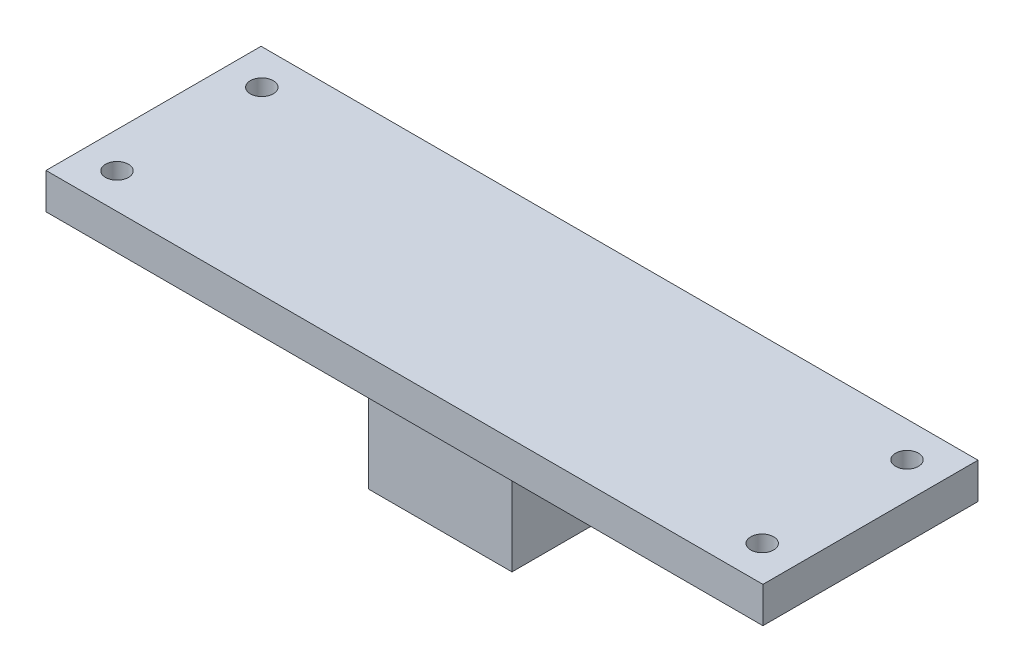
ISO-10303-21;
HEADER;
FILE_DESCRIPTION(('STEP AP214'),'2;1');
FILE_NAME('part.step','',(''),(''),'','','');
FILE_SCHEMA(('AUTOMOTIVE_DESIGN { 1 0 10303 214 1 1 1 1 }'));
ENDSEC;
DATA;
#1=APPLICATION_CONTEXT('core data for automotive mechanical design processes');
#2=APPLICATION_PROTOCOL_DEFINITION('international standard','automotive_design',2000,#1);
#3=PRODUCT_CONTEXT('',#1,'mechanical');
#4=PRODUCT('Part','Part','',(#3));
#5=PRODUCT_RELATED_PRODUCT_CATEGORY('part','',(#4));
#6=PRODUCT_DEFINITION_FORMATION('','',#4);
#7=PRODUCT_DEFINITION_CONTEXT('part definition',#1,'design');
#8=PRODUCT_DEFINITION('design','',#6,#7);
#9=PRODUCT_DEFINITION_SHAPE('','',#8);
#10=(LENGTH_UNIT() NAMED_UNIT(*) SI_UNIT(.MILLI.,.METRE.));
#11=(NAMED_UNIT(*) PLANE_ANGLE_UNIT() SI_UNIT($,.RADIAN.));
#12=(NAMED_UNIT(*) SI_UNIT($,.STERADIAN.) SOLID_ANGLE_UNIT());
#13=UNCERTAINTY_MEASURE_WITH_UNIT(LENGTH_MEASURE(1.E-05),#10,'distance_accuracy_value','');
#14=(GEOMETRIC_REPRESENTATION_CONTEXT(3) GLOBAL_UNCERTAINTY_ASSIGNED_CONTEXT((#13)) GLOBAL_UNIT_ASSIGNED_CONTEXT((#10,
#11,#12)) REPRESENTATION_CONTEXT('',''));
#15=CARTESIAN_POINT('',(0.,0.,0.));
#16=DIRECTION('',(0.,0.,1.));
#17=DIRECTION('',(1.,0.,0.));
#18=AXIS2_PLACEMENT_3D('',#15,#16,#17);
#19=CARTESIAN_POINT('',(0.,0.,0.));
#20=DIRECTION('',(0.,1.,0.));
#21=DIRECTION('',(0.,0.,1.));
#22=AXIS2_PLACEMENT_3D('',#19,#20,#21);
#23=PLANE('',#22);
#24=DIRECTION('',(0.,0.,1.));
#25=VECTOR('',#24,1.);
#26=CARTESIAN_POINT('',(-39.671682626539,0.,-20.7934336525308));
#27=LINE('',#26,#25);
#28=CARTESIAN_POINT('',(-39.671682626539,0.,-20.7934336525308));
#29=VERTEX_POINT('',#28);
#30=CARTESIAN_POINT('',(-39.671682626539,0.,9.20656634746923));
#31=VERTEX_POINT('',#30);
#32=EDGE_CURVE('E259',#29,#31,#27,.T.);
#33=ORIENTED_EDGE('',*,*,#32,.F.);
#34=DIRECTION('',(-1.,0.,0.));
#35=VECTOR('',#34,1.);
#36=CARTESIAN_POINT('',(-39.671682626539,0.,-20.7934336525308));
#37=LINE('',#36,#35);
#38=CARTESIAN_POINT('',(60.328317373461,0.,-20.7934336525308));
#39=VERTEX_POINT('',#38);
#40=EDGE_CURVE('E268',#39,#29,#37,.T.);
#41=ORIENTED_EDGE('',*,*,#40,.F.);
#42=DIRECTION('',(0.,0.,-1.));
#43=VECTOR('',#42,1.);
#44=CARTESIAN_POINT('',(60.328317373461,0.,-20.7934336525308));
#45=LINE('',#44,#43);
#46=CARTESIAN_POINT('',(60.328317373461,0.,9.20656634746923));
#47=VERTEX_POINT('',#46);
#48=EDGE_CURVE('E284',#47,#39,#45,.T.);
#49=ORIENTED_EDGE('',*,*,#48,.F.);
#50=DIRECTION('',(1.,0.,0.));
#51=VECTOR('',#50,1.);
#52=CARTESIAN_POINT('',(-39.671682626539,0.,9.20656634746923));
#53=LINE('',#52,#51);
#54=EDGE_CURVE('E281',#31,#47,#53,.T.);
#55=ORIENTED_EDGE('',*,*,#54,.F.);
#56=EDGE_LOOP('',(#33,#41,#49,#55));
#57=FACE_BOUND('',#56,.T.);
#58=CARTESIAN_POINT('',(55.328317373461,0.,-15.8934336525308));
#59=DIRECTION('',(0.,1.,0.));
#60=DIRECTION('',(0.,0.,1.));
#61=AXIS2_PLACEMENT_3D('',#58,#59,#60);
#62=CIRCLE('',#61,1.6);
#63=CARTESIAN_POINT('',(55.328317373461,0.,-14.2934336525308));
#64=VERTEX_POINT('',#63);
#65=EDGE_CURVE('E255',#64,#64,#62,.T.);
#66=ORIENTED_EDGE('',*,*,#65,.T.);
#67=EDGE_LOOP('',(#66));
#68=FACE_BOUND('',#67,.T.);
#69=CARTESIAN_POINT('',(55.328317373461,0.,4.30656634746923));
#70=DIRECTION('',(0.,1.,0.));
#71=DIRECTION('',(0.,0.,1.));
#72=AXIS2_PLACEMENT_3D('',#69,#70,#71);
#73=CIRCLE('',#72,1.6);
#74=CARTESIAN_POINT('',(55.328317373461,0.,5.90656634746922));
#75=VERTEX_POINT('',#74);
#76=EDGE_CURVE('E236',#75,#75,#73,.T.);
#77=ORIENTED_EDGE('',*,*,#76,.T.);
#78=EDGE_LOOP('',(#77));
#79=FACE_BOUND('',#78,.T.);
#80=CARTESIAN_POINT('',(-34.671682626539,0.,4.30656634746923));
#81=DIRECTION('',(0.,1.,0.));
#82=DIRECTION('',(0.,0.,1.));
#83=AXIS2_PLACEMENT_3D('',#80,#81,#82);
#84=CIRCLE('',#83,1.6);
#85=CARTESIAN_POINT('',(-34.671682626539,0.,5.90656634746922));
#86=VERTEX_POINT('',#85);
#87=EDGE_CURVE('E244',#86,#86,#84,.T.);
#88=ORIENTED_EDGE('',*,*,#87,.T.);
#89=EDGE_LOOP('',(#88));
#90=FACE_BOUND('',#89,.T.);
#91=CARTESIAN_POINT('',(-34.671682626539,0.,-15.8934336525308));
#92=DIRECTION('',(0.,1.,0.));
#93=DIRECTION('',(0.,0.,1.));
#94=AXIS2_PLACEMENT_3D('',#91,#92,#93);
#95=CIRCLE('',#94,1.6);
#96=CARTESIAN_POINT('',(-34.671682626539,0.,-14.2934336525308));
#97=VERTEX_POINT('',#96);
#98=EDGE_CURVE('E230',#97,#97,#95,.T.);
#99=ORIENTED_EDGE('',*,*,#98,.T.);
#100=EDGE_LOOP('',(#99));
#101=FACE_BOUND('',#100,.T.);
#102=DIRECTION('',(0.,0.,-1.));
#103=VECTOR('',#102,1.);
#104=CARTESIAN_POINT('',(0.328317373461031,0.,4.20656634746923));
#105=LINE('',#104,#103);
#106=CARTESIAN_POINT('',(0.328317373461031,0.,4.20656634746923));
#107=VERTEX_POINT('',#106);
#108=CARTESIAN_POINT('',(0.328317373461033,0.,-15.7934336525308));
#109=VERTEX_POINT('',#108);
#110=EDGE_CURVE('E183',#107,#109,#105,.T.);
#111=ORIENTED_EDGE('',*,*,#110,.F.);
#112=DIRECTION('',(-1.,0.,0.));
#113=VECTOR('',#112,1.);
#114=CARTESIAN_POINT('',(0.328317373461031,0.,4.20656634746923));
#115=LINE('',#114,#113);
#116=CARTESIAN_POINT('',(20.328317373461,0.,4.20656634746923));
#117=VERTEX_POINT('',#116);
#118=EDGE_CURVE('E194',#117,#107,#115,.T.);
#119=ORIENTED_EDGE('',*,*,#118,.F.);
#120=DIRECTION('',(0.,0.,1.));
#121=VECTOR('',#120,1.);
#122=CARTESIAN_POINT('',(20.328317373461,0.,4.20656634746923));
#123=LINE('',#122,#121);
#124=CARTESIAN_POINT('',(20.328317373461,0.,-15.7934336525308));
#125=VERTEX_POINT('',#124);
#126=EDGE_CURVE('E209',#125,#117,#123,.T.);
#127=ORIENTED_EDGE('',*,*,#126,.F.);
#128=DIRECTION('',(1.,0.,0.));
#129=VECTOR('',#128,1.);
#130=CARTESIAN_POINT('',(0.328317373461033,0.,-15.7934336525308));
#131=LINE('',#130,#129);
#132=EDGE_CURVE('E70',#109,#125,#131,.T.);
#133=ORIENTED_EDGE('',*,*,#132,.F.);
#134=EDGE_LOOP('',(#111,#119,#127,#133));
#135=FACE_BOUND('',#134,.T.);
#136=ADVANCED_FACE('F45',(#57,#68,#79,#90,#101,#135),#23,.F.);
#137=CARTESIAN_POINT('',(-39.671682626539,5.,-20.7934336525308));
#138=DIRECTION('',(1.,0.,0.));
#139=DIRECTION('',(0.,0.,-1.));
#140=AXIS2_PLACEMENT_3D('',#137,#138,#139);
#141=PLANE('',#140);
#142=ORIENTED_EDGE('',*,*,#32,.T.);
#143=DIRECTION('',(0.,-1.,0.));
#144=VECTOR('',#143,1.);
#145=CARTESIAN_POINT('',(-39.671682626539,5.,9.20656634746923));
#146=LINE('',#145,#144);
#147=CARTESIAN_POINT('',(-39.671682626539,5.,9.20656634746923));
#148=VERTEX_POINT('',#147);
#149=EDGE_CURVE('E11',#148,#31,#146,.T.);
#150=ORIENTED_EDGE('',*,*,#149,.F.);
#151=DIRECTION('',(0.,0.,1.));
#152=VECTOR('',#151,1.);
#153=CARTESIAN_POINT('',(-39.671682626539,5.,-20.7934336525308));
#154=LINE('',#153,#152);
#155=CARTESIAN_POINT('',(-39.671682626539,5.,-20.7934336525308));
#156=VERTEX_POINT('',#155);
#157=EDGE_CURVE('E263',#156,#148,#154,.T.);
#158=ORIENTED_EDGE('',*,*,#157,.F.);
#159=DIRECTION('',(0.,-1.,0.));
#160=VECTOR('',#159,1.);
#161=CARTESIAN_POINT('',(-39.671682626539,5.,-20.7934336525308));
#162=LINE('',#161,#160);
#163=EDGE_CURVE('E277',#156,#29,#162,.T.);
#164=ORIENTED_EDGE('',*,*,#163,.T.);
#165=EDGE_LOOP('',(#142,#150,#158,#164));
#166=FACE_BOUND('',#165,.T.);
#167=ADVANCED_FACE('F47',(#166),#141,.F.);
#168=CARTESIAN_POINT('',(-39.671682626539,5.,9.20656634746923));
#169=DIRECTION('',(0.,0.,-1.));
#170=DIRECTION('',(-1.,0.,0.));
#171=AXIS2_PLACEMENT_3D('',#168,#169,#170);
#172=PLANE('',#171);
#173=ORIENTED_EDGE('',*,*,#54,.T.);
#174=DIRECTION('',(0.,-1.,0.));
#175=VECTOR('',#174,1.);
#176=CARTESIAN_POINT('',(60.328317373461,5.,9.20656634746923));
#177=LINE('',#176,#175);
#178=CARTESIAN_POINT('',(60.328317373461,5.,9.20656634746923));
#179=VERTEX_POINT('',#178);
#180=EDGE_CURVE('E55',#179,#47,#177,.T.);
#181=ORIENTED_EDGE('',*,*,#180,.F.);
#182=DIRECTION('',(1.,0.,0.));
#183=VECTOR('',#182,1.);
#184=CARTESIAN_POINT('',(-39.671682626539,5.,9.20656634746923));
#185=LINE('',#184,#183);
#186=EDGE_CURVE('E267',#148,#179,#185,.T.);
#187=ORIENTED_EDGE('',*,*,#186,.F.);
#188=ORIENTED_EDGE('',*,*,#149,.T.);
#189=EDGE_LOOP('',(#173,#181,#187,#188));
#190=FACE_BOUND('',#189,.T.);
#191=ADVANCED_FACE('F318',(#190),#172,.F.);
#192=CARTESIAN_POINT('',(60.328317373461,5.,-20.7934336525308));
#193=DIRECTION('',(-1.,0.,0.));
#194=DIRECTION('',(0.,0.,1.));
#195=AXIS2_PLACEMENT_3D('',#192,#193,#194);
#196=PLANE('',#195);
#197=ORIENTED_EDGE('',*,*,#48,.T.);
#198=DIRECTION('',(0.,-1.,0.));
#199=VECTOR('',#198,1.);
#200=CARTESIAN_POINT('',(60.328317373461,5.,-20.7934336525308));
#201=LINE('',#200,#199);
#202=CARTESIAN_POINT('',(60.328317373461,5.,-20.7934336525308));
#203=VERTEX_POINT('',#202);
#204=EDGE_CURVE('E292',#203,#39,#201,.T.);
#205=ORIENTED_EDGE('',*,*,#204,.F.);
#206=DIRECTION('',(0.,0.,-1.));
#207=VECTOR('',#206,1.);
#208=CARTESIAN_POINT('',(60.328317373461,5.,-20.7934336525308));
#209=LINE('',#208,#207);
#210=EDGE_CURVE('E271',#179,#203,#209,.T.);
#211=ORIENTED_EDGE('',*,*,#210,.F.);
#212=ORIENTED_EDGE('',*,*,#180,.T.);
#213=EDGE_LOOP('',(#197,#205,#211,#212));
#214=FACE_BOUND('',#213,.T.);
#215=ADVANCED_FACE('F302',(#214),#196,.F.);
#216=CARTESIAN_POINT('',(-39.671682626539,5.,-20.7934336525308));
#217=DIRECTION('',(0.,0.,1.));
#218=DIRECTION('',(1.,0.,0.));
#219=AXIS2_PLACEMENT_3D('',#216,#217,#218);
#220=PLANE('',#219);
#221=ORIENTED_EDGE('',*,*,#40,.T.);
#222=ORIENTED_EDGE('',*,*,#163,.F.);
#223=DIRECTION('',(-1.,0.,0.));
#224=VECTOR('',#223,1.);
#225=CARTESIAN_POINT('',(-39.671682626539,5.,-20.7934336525308));
#226=LINE('',#225,#224);
#227=EDGE_CURVE('E274',#203,#156,#226,.T.);
#228=ORIENTED_EDGE('',*,*,#227,.F.);
#229=ORIENTED_EDGE('',*,*,#204,.T.);
#230=EDGE_LOOP('',(#221,#222,#228,#229));
#231=FACE_BOUND('',#230,.T.);
#232=ADVANCED_FACE('F311',(#231),#220,.F.);
#233=CARTESIAN_POINT('',(0.,5.,0.));
#234=DIRECTION('',(0.,1.,0.));
#235=DIRECTION('',(0.,0.,1.));
#236=AXIS2_PLACEMENT_3D('',#233,#234,#235);
#237=PLANE('',#236);
#238=CARTESIAN_POINT('',(-34.671682626539,5.,-15.8934336525308));
#239=DIRECTION('',(0.,1.,0.));
#240=DIRECTION('',(0.,0.,1.));
#241=AXIS2_PLACEMENT_3D('',#238,#239,#240);
#242=CIRCLE('',#241,1.6);
#243=CARTESIAN_POINT('',(-34.671682626539,5.,-14.2934336525308));
#244=VERTEX_POINT('',#243);
#245=EDGE_CURVE('E248',#244,#244,#242,.T.);
#246=ORIENTED_EDGE('',*,*,#245,.F.);
#247=EDGE_LOOP('',(#246));
#248=FACE_BOUND('',#247,.T.);
#249=CARTESIAN_POINT('',(-34.671682626539,5.,4.30656634746923));
#250=DIRECTION('',(0.,1.,0.));
#251=DIRECTION('',(0.,0.,1.));
#252=AXIS2_PLACEMENT_3D('',#249,#250,#251);
#253=CIRCLE('',#252,1.6);
#254=CARTESIAN_POINT('',(-34.671682626539,5.,5.90656634746922));
#255=VERTEX_POINT('',#254);
#256=EDGE_CURVE('E240',#255,#255,#253,.T.);
#257=ORIENTED_EDGE('',*,*,#256,.F.);
#258=EDGE_LOOP('',(#257));
#259=FACE_BOUND('',#258,.T.);
#260=CARTESIAN_POINT('',(55.328317373461,5.,4.30656634746923));
#261=DIRECTION('',(0.,1.,0.));
#262=DIRECTION('',(0.,0.,1.));
#263=AXIS2_PLACEMENT_3D('',#260,#261,#262);
#264=CIRCLE('',#263,1.6);
#265=CARTESIAN_POINT('',(55.328317373461,5.,5.90656634746922));
#266=VERTEX_POINT('',#265);
#267=EDGE_CURVE('E231',#266,#266,#264,.T.);
#268=ORIENTED_EDGE('',*,*,#267,.F.);
#269=EDGE_LOOP('',(#268));
#270=FACE_BOUND('',#269,.T.);
#271=CARTESIAN_POINT('',(55.328317373461,5.,-15.8934336525308));
#272=DIRECTION('',(0.,1.,0.));
#273=DIRECTION('',(0.,0.,1.));
#274=AXIS2_PLACEMENT_3D('',#271,#272,#273);
#275=CIRCLE('',#274,1.6);
#276=CARTESIAN_POINT('',(55.328317373461,5.,-14.2934336525308));
#277=VERTEX_POINT('',#276);
#278=EDGE_CURVE('E235',#277,#277,#275,.T.);
#279=ORIENTED_EDGE('',*,*,#278,.F.);
#280=EDGE_LOOP('',(#279));
#281=FACE_BOUND('',#280,.T.);
#282=ORIENTED_EDGE('',*,*,#157,.T.);
#283=ORIENTED_EDGE('',*,*,#186,.T.);
#284=ORIENTED_EDGE('',*,*,#210,.T.);
#285=ORIENTED_EDGE('',*,*,#227,.T.);
#286=EDGE_LOOP('',(#282,#283,#284,#285));
#287=FACE_BOUND('',#286,.T.);
#288=ADVANCED_FACE('F317',(#248,#259,#270,#281,#287),#237,.T.);
#289=CARTESIAN_POINT('',(55.328317373461,0.,-15.8934336525308));
#290=DIRECTION('',(0.,1.,0.));
#291=DIRECTION('',(0.,0.,1.));
#292=AXIS2_PLACEMENT_3D('',#289,#290,#291);
#293=CYLINDRICAL_SURFACE('',#292,1.6);
#294=ORIENTED_EDGE('',*,*,#65,.F.);
#295=EDGE_LOOP('',(#294));
#296=FACE_BOUND('',#295,.T.);
#297=ORIENTED_EDGE('',*,*,#278,.T.);
#298=EDGE_LOOP('',(#297));
#299=FACE_BOUND('',#298,.T.);
#300=ADVANCED_FACE('F336',(#296,#299),#293,.F.);
#301=CARTESIAN_POINT('',(55.328317373461,0.,4.30656634746923));
#302=DIRECTION('',(0.,1.,0.));
#303=DIRECTION('',(0.,0.,1.));
#304=AXIS2_PLACEMENT_3D('',#301,#302,#303);
#305=CYLINDRICAL_SURFACE('',#304,1.6);
#306=ORIENTED_EDGE('',*,*,#76,.F.);
#307=EDGE_LOOP('',(#306));
#308=FACE_BOUND('',#307,.T.);
#309=ORIENTED_EDGE('',*,*,#267,.T.);
#310=EDGE_LOOP('',(#309));
#311=FACE_BOUND('',#310,.T.);
#312=ADVANCED_FACE('F341',(#308,#311),#305,.F.);
#313=CARTESIAN_POINT('',(-34.671682626539,0.,4.30656634746923));
#314=DIRECTION('',(0.,1.,0.));
#315=DIRECTION('',(0.,0.,1.));
#316=AXIS2_PLACEMENT_3D('',#313,#314,#315);
#317=CYLINDRICAL_SURFACE('',#316,1.6);
#318=ORIENTED_EDGE('',*,*,#87,.F.);
#319=EDGE_LOOP('',(#318));
#320=FACE_BOUND('',#319,.T.);
#321=ORIENTED_EDGE('',*,*,#256,.T.);
#322=EDGE_LOOP('',(#321));
#323=FACE_BOUND('',#322,.T.);
#324=ADVANCED_FACE('F353',(#320,#323),#317,.F.);
#325=CARTESIAN_POINT('',(-34.671682626539,0.,-15.8934336525308));
#326=DIRECTION('',(0.,1.,0.));
#327=DIRECTION('',(0.,0.,1.));
#328=AXIS2_PLACEMENT_3D('',#325,#326,#327);
#329=CYLINDRICAL_SURFACE('',#328,1.6);
#330=ORIENTED_EDGE('',*,*,#98,.F.);
#331=EDGE_LOOP('',(#330));
#332=FACE_BOUND('',#331,.T.);
#333=ORIENTED_EDGE('',*,*,#245,.T.);
#334=EDGE_LOOP('',(#333));
#335=FACE_BOUND('',#334,.T.);
#336=ADVANCED_FACE('F359',(#332,#335),#329,.F.);
#337=CARTESIAN_POINT('',(0.328317373461031,-16.,4.20656634746923));
#338=DIRECTION('',(1.,0.,0.));
#339=DIRECTION('',(0.,0.,-1.));
#340=AXIS2_PLACEMENT_3D('',#337,#338,#339);
#341=PLANE('',#340);
#342=ORIENTED_EDGE('',*,*,#110,.T.);
#343=DIRECTION('',(0.,1.,0.));
#344=VECTOR('',#343,1.);
#345=CARTESIAN_POINT('',(0.328317373461033,-16.,-15.7934336525308));
#346=LINE('',#345,#344);
#347=CARTESIAN_POINT('',(0.328317373461033,-16.,-15.7934336525308));
#348=VERTEX_POINT('',#347);
#349=EDGE_CURVE('E227',#348,#109,#346,.T.);
#350=ORIENTED_EDGE('',*,*,#349,.F.);
#351=DIRECTION('',(0.,0.,-1.));
#352=VECTOR('',#351,1.);
#353=CARTESIAN_POINT('',(0.328317373461031,-16.,4.20656634746923));
#354=LINE('',#353,#352);
#355=CARTESIAN_POINT('',(0.328317373461031,-16.,4.20656634746923));
#356=VERTEX_POINT('',#355);
#357=EDGE_CURVE('E189',#356,#348,#354,.T.);
#358=ORIENTED_EDGE('',*,*,#357,.F.);
#359=DIRECTION('',(0.,1.,0.));
#360=VECTOR('',#359,1.);
#361=CARTESIAN_POINT('',(0.328317373461031,-16.,4.20656634746923));
#362=LINE('',#361,#360);
#363=EDGE_CURVE('E203',#356,#107,#362,.T.);
#364=ORIENTED_EDGE('',*,*,#363,.T.);
#365=EDGE_LOOP('',(#342,#350,#358,#364));
#366=FACE_BOUND('',#365,.T.);
#367=ADVANCED_FACE('F364',(#366),#341,.F.);
#368=CARTESIAN_POINT('',(0.328317373461033,-16.,-15.7934336525308));
#369=DIRECTION('',(0.,0.,1.));
#370=DIRECTION('',(1.,0.,0.));
#371=AXIS2_PLACEMENT_3D('',#368,#369,#370);
#372=PLANE('',#371);
#373=ORIENTED_EDGE('',*,*,#132,.T.);
#374=DIRECTION('',(0.,1.,0.));
#375=VECTOR('',#374,1.);
#376=CARTESIAN_POINT('',(20.328317373461,-16.,-15.7934336525308));
#377=LINE('',#376,#375);
#378=CARTESIAN_POINT('',(20.328317373461,-16.,-15.7934336525308));
#379=VERTEX_POINT('',#378);
#380=EDGE_CURVE('E223',#379,#125,#377,.T.);
#381=ORIENTED_EDGE('',*,*,#380,.F.);
#382=DIRECTION('',(1.,0.,0.));
#383=VECTOR('',#382,1.);
#384=CARTESIAN_POINT('',(0.328317373461033,-16.,-15.7934336525308));
#385=LINE('',#384,#383);
#386=EDGE_CURVE('E193',#348,#379,#385,.T.);
#387=ORIENTED_EDGE('',*,*,#386,.F.);
#388=ORIENTED_EDGE('',*,*,#349,.T.);
#389=EDGE_LOOP('',(#373,#381,#387,#388));
#390=FACE_BOUND('',#389,.T.);
#391=ADVANCED_FACE('F372',(#390),#372,.F.);
#392=CARTESIAN_POINT('',(20.328317373461,-16.,4.20656634746923));
#393=DIRECTION('',(-1.,0.,0.));
#394=DIRECTION('',(0.,0.,1.));
#395=AXIS2_PLACEMENT_3D('',#392,#393,#394);
#396=PLANE('',#395);
#397=CARTESIAN_POINT('',(20.328317373461,-7.,-5.79343365253077));
#398=DIRECTION('',(1.,0.,0.));
#399=DIRECTION('',(0.,0.,-1.));
#400=AXIS2_PLACEMENT_3D('',#397,#398,#399);
#401=CIRCLE('',#400,2.5);
#402=CARTESIAN_POINT('',(20.328317373461,-7.,-8.29343365253077));
#403=VERTEX_POINT('',#402);
#404=EDGE_CURVE('E166',#403,#403,#401,.T.);
#405=ORIENTED_EDGE('',*,*,#404,.F.);
#406=EDGE_LOOP('',(#405));
#407=FACE_BOUND('',#406,.T.);
#408=ORIENTED_EDGE('',*,*,#126,.T.);
#409=DIRECTION('',(0.,1.,0.));
#410=VECTOR('',#409,1.);
#411=CARTESIAN_POINT('',(20.328317373461,-16.,4.20656634746923));
#412=LINE('',#411,#410);
#413=CARTESIAN_POINT('',(20.328317373461,-16.,4.20656634746923));
#414=VERTEX_POINT('',#413);
#415=EDGE_CURVE('E219',#414,#117,#412,.T.);
#416=ORIENTED_EDGE('',*,*,#415,.F.);
#417=DIRECTION('',(0.,0.,1.));
#418=VECTOR('',#417,1.);
#419=CARTESIAN_POINT('',(20.328317373461,-16.,4.20656634746923));
#420=LINE('',#419,#418);
#421=EDGE_CURVE('E197',#379,#414,#420,.T.);
#422=ORIENTED_EDGE('',*,*,#421,.F.);
#423=ORIENTED_EDGE('',*,*,#380,.T.);
#424=EDGE_LOOP('',(#408,#416,#422,#423));
#425=FACE_BOUND('',#424,.T.);
#426=ADVANCED_FACE('F389',(#407,#425),#396,.F.);
#427=CARTESIAN_POINT('',(0.328317373461031,-16.,4.20656634746923));
#428=DIRECTION('',(0.,0.,-1.));
#429=DIRECTION('',(-1.,0.,0.));
#430=AXIS2_PLACEMENT_3D('',#427,#428,#429);
#431=PLANE('',#430);
#432=ORIENTED_EDGE('',*,*,#118,.T.);
#433=ORIENTED_EDGE('',*,*,#363,.F.);
#434=DIRECTION('',(-1.,0.,0.));
#435=VECTOR('',#434,1.);
#436=CARTESIAN_POINT('',(0.328317373461031,-16.,4.20656634746923));
#437=LINE('',#436,#435);
#438=EDGE_CURVE('E200',#414,#356,#437,.T.);
#439=ORIENTED_EDGE('',*,*,#438,.F.);
#440=ORIENTED_EDGE('',*,*,#415,.T.);
#441=EDGE_LOOP('',(#432,#433,#439,#440));
#442=FACE_BOUND('',#441,.T.);
#443=ADVANCED_FACE('F380',(#442),#431,.F.);
#444=CARTESIAN_POINT('',(0.,-16.,0.));
#445=DIRECTION('',(0.,-1.,0.));
#446=DIRECTION('',(0.,0.,-1.));
#447=AXIS2_PLACEMENT_3D('',#444,#445,#446);
#448=PLANE('',#447);
#449=DIRECTION('',(0.,0.,-1.));
#450=VECTOR('',#449,1.);
#451=CARTESIAN_POINT('',(3.82831737346104,-16.,0.706566347469224));
#452=LINE('',#451,#450);
#453=CARTESIAN_POINT('',(3.82831737346104,-16.,0.706566347469224));
#454=VERTEX_POINT('',#453);
#455=CARTESIAN_POINT('',(3.82831737346104,-16.,-12.2934336525308));
#456=VERTEX_POINT('',#455);
#457=EDGE_CURVE('E62',#454,#456,#452,.T.);
#458=ORIENTED_EDGE('',*,*,#457,.F.);
#459=DIRECTION('',(-1.,0.,0.));
#460=VECTOR('',#459,1.);
#461=CARTESIAN_POINT('',(3.82831737346104,-16.,0.706566347469224));
#462=LINE('',#461,#460);
#463=CARTESIAN_POINT('',(16.828317373461,-16.,0.706566347469224));
#464=VERTEX_POINT('',#463);
#465=EDGE_CURVE('E159',#464,#454,#462,.T.);
#466=ORIENTED_EDGE('',*,*,#465,.F.);
#467=DIRECTION('',(0.,0.,1.));
#468=VECTOR('',#467,1.);
#469=CARTESIAN_POINT('',(16.828317373461,-16.,0.706566347469224));
#470=LINE('',#469,#468);
#471=CARTESIAN_POINT('',(16.828317373461,-16.,-12.2934336525308));
#472=VERTEX_POINT('',#471);
#473=EDGE_CURVE('E163',#472,#464,#470,.T.);
#474=ORIENTED_EDGE('',*,*,#473,.F.);
#475=DIRECTION('',(1.,0.,0.));
#476=VECTOR('',#475,1.);
#477=CARTESIAN_POINT('',(3.82831737346104,-16.,-12.2934336525308));
#478=LINE('',#477,#476);
#479=EDGE_CURVE('E174',#456,#472,#478,.T.);
#480=ORIENTED_EDGE('',*,*,#479,.F.);
#481=EDGE_LOOP('',(#458,#466,#474,#480));
#482=FACE_BOUND('',#481,.T.);
#483=ORIENTED_EDGE('',*,*,#357,.T.);
#484=ORIENTED_EDGE('',*,*,#386,.T.);
#485=ORIENTED_EDGE('',*,*,#421,.T.);
#486=ORIENTED_EDGE('',*,*,#438,.T.);
#487=EDGE_LOOP('',(#483,#484,#485,#486));
#488=FACE_BOUND('',#487,.T.);
#489=ADVANCED_FACE('F385',(#482,#488),#448,.T.);
#490=CARTESIAN_POINT('',(3.82831737346104,0.,0.706566347469224));
#491=DIRECTION('',(-1.,0.,0.));
#492=DIRECTION('',(0.,0.,1.));
#493=AXIS2_PLACEMENT_3D('',#490,#491,#492);
#494=PLANE('',#493);
#495=ORIENTED_EDGE('',*,*,#457,.T.);
#496=DIRECTION('',(0.,-1.,0.));
#497=VECTOR('',#496,1.);
#498=CARTESIAN_POINT('',(3.82831737346104,0.,-12.2934336525308));
#499=LINE('',#498,#497);
#500=CARTESIAN_POINT('',(3.82831737346104,0.,-12.2934336525308));
#501=VERTEX_POINT('',#500);
#502=EDGE_CURVE('E134',#501,#456,#499,.T.);
#503=ORIENTED_EDGE('',*,*,#502,.F.);
#504=DIRECTION('',(0.,0.,-1.));
#505=VECTOR('',#504,1.);
#506=CARTESIAN_POINT('',(3.82831737346104,0.,0.706566347469224));
#507=LINE('',#506,#505);
#508=CARTESIAN_POINT('',(3.82831737346104,0.,0.706566347469224));
#509=VERTEX_POINT('',#508);
#510=EDGE_CURVE('E138',#509,#501,#507,.T.);
#511=ORIENTED_EDGE('',*,*,#510,.F.);
#512=DIRECTION('',(0.,-1.,0.));
#513=VECTOR('',#512,1.);
#514=CARTESIAN_POINT('',(3.82831737346104,0.,0.706566347469224));
#515=LINE('',#514,#513);
#516=EDGE_CURVE('E180',#509,#454,#515,.T.);
#517=ORIENTED_EDGE('',*,*,#516,.T.);
#518=EDGE_LOOP('',(#495,#503,#511,#517));
#519=FACE_BOUND('',#518,.T.);
#520=ADVANCED_FACE('F136',(#519),#494,.F.);
#521=CARTESIAN_POINT('',(3.82831737346104,0.,0.706566347469224));
#522=DIRECTION('',(0.,0.,1.));
#523=DIRECTION('',(1.,0.,0.));
#524=AXIS2_PLACEMENT_3D('',#521,#522,#523);
#525=PLANE('',#524);
#526=ORIENTED_EDGE('',*,*,#465,.T.);
#527=ORIENTED_EDGE('',*,*,#516,.F.);
#528=DIRECTION('',(-1.,0.,0.));
#529=VECTOR('',#528,1.);
#530=CARTESIAN_POINT('',(3.82831737346104,0.,0.706566347469224));
#531=LINE('',#530,#529);
#532=CARTESIAN_POINT('',(16.828317373461,0.,0.706566347469224));
#533=VERTEX_POINT('',#532);
#534=EDGE_CURVE('E145',#533,#509,#531,.T.);
#535=ORIENTED_EDGE('',*,*,#534,.F.);
#536=DIRECTION('',(0.,-1.,0.));
#537=VECTOR('',#536,1.);
#538=CARTESIAN_POINT('',(16.828317373461,0.,0.706566347469224));
#539=LINE('',#538,#537);
#540=EDGE_CURVE('E184',#533,#464,#539,.T.);
#541=ORIENTED_EDGE('',*,*,#540,.T.);
#542=EDGE_LOOP('',(#526,#527,#535,#541));
#543=FACE_BOUND('',#542,.T.);
#544=ADVANCED_FACE('F405',(#543),#525,.F.);
#545=CARTESIAN_POINT('',(16.828317373461,0.,0.706566347469224));
#546=DIRECTION('',(1.,0.,0.));
#547=DIRECTION('',(0.,0.,-1.));
#548=AXIS2_PLACEMENT_3D('',#545,#546,#547);
#549=PLANE('',#548);
#550=CARTESIAN_POINT('',(16.828317373461,-7.,-5.79343365253078));
#551=DIRECTION('',(1.,0.,0.));
#552=DIRECTION('',(0.,0.,-1.));
#553=AXIS2_PLACEMENT_3D('',#550,#551,#552);
#554=CIRCLE('',#553,2.5);
#555=CARTESIAN_POINT('',(16.828317373461,-7.,-8.29343365253077));
#556=VERTEX_POINT('',#555);
#557=EDGE_CURVE('E49',#556,#556,#554,.T.);
#558=ORIENTED_EDGE('',*,*,#557,.T.);
#559=EDGE_LOOP('',(#558));
#560=FACE_BOUND('',#559,.T.);
#561=ORIENTED_EDGE('',*,*,#473,.T.);
#562=ORIENTED_EDGE('',*,*,#540,.F.);
#563=DIRECTION('',(0.,0.,1.));
#564=VECTOR('',#563,1.);
#565=CARTESIAN_POINT('',(16.828317373461,0.,0.706566347469224));
#566=LINE('',#565,#564);
#567=CARTESIAN_POINT('',(16.828317373461,0.,-12.2934336525308));
#568=VERTEX_POINT('',#567);
#569=EDGE_CURVE('E154',#568,#533,#566,.T.);
#570=ORIENTED_EDGE('',*,*,#569,.F.);
#571=DIRECTION('',(0.,-1.,0.));
#572=VECTOR('',#571,1.);
#573=CARTESIAN_POINT('',(16.828317373461,0.,-12.2934336525308));
#574=LINE('',#573,#572);
#575=EDGE_CURVE('E144',#568,#472,#574,.T.);
#576=ORIENTED_EDGE('',*,*,#575,.T.);
#577=EDGE_LOOP('',(#561,#562,#570,#576));
#578=FACE_BOUND('',#577,.T.);
#579=ADVANCED_FACE('F408',(#560,#578),#549,.F.);
#580=CARTESIAN_POINT('',(3.82831737346104,0.,-12.2934336525308));
#581=DIRECTION('',(0.,0.,-1.));
#582=DIRECTION('',(-1.,0.,0.));
#583=AXIS2_PLACEMENT_3D('',#580,#581,#582);
#584=PLANE('',#583);
#585=ORIENTED_EDGE('',*,*,#479,.T.);
#586=ORIENTED_EDGE('',*,*,#575,.F.);
#587=DIRECTION('',(1.,0.,0.));
#588=VECTOR('',#587,1.);
#589=CARTESIAN_POINT('',(3.82831737346104,0.,-12.2934336525308));
#590=LINE('',#589,#588);
#591=EDGE_CURVE('E148',#501,#568,#590,.T.);
#592=ORIENTED_EDGE('',*,*,#591,.F.);
#593=ORIENTED_EDGE('',*,*,#502,.T.);
#594=EDGE_LOOP('',(#585,#586,#592,#593));
#595=FACE_BOUND('',#594,.T.);
#596=ADVANCED_FACE('F149',(#595),#584,.F.);
#597=CARTESIAN_POINT('',(0.,0.,0.));
#598=DIRECTION('',(0.,-1.,0.));
#599=DIRECTION('',(0.,0.,-1.));
#600=AXIS2_PLACEMENT_3D('',#597,#598,#599);
#601=PLANE('',#600);
#602=ORIENTED_EDGE('',*,*,#510,.T.);
#603=ORIENTED_EDGE('',*,*,#591,.T.);
#604=ORIENTED_EDGE('',*,*,#569,.T.);
#605=ORIENTED_EDGE('',*,*,#534,.T.);
#606=EDGE_LOOP('',(#602,#603,#604,#605));
#607=FACE_BOUND('',#606,.T.);
#608=ADVANCED_FACE('F156',(#607),#601,.T.);
#609=CARTESIAN_POINT('',(10.328317373461,-7.,-5.79343365253078));
#610=DIRECTION('',(1.,0.,0.));
#611=DIRECTION('',(0.,0.,-1.));
#612=AXIS2_PLACEMENT_3D('',#609,#610,#611);
#613=CYLINDRICAL_SURFACE('',#612,2.5);
#614=ORIENTED_EDGE('',*,*,#404,.T.);
#615=EDGE_LOOP('',(#614));
#616=FACE_BOUND('',#615,.T.);
#617=ORIENTED_EDGE('',*,*,#557,.F.);
#618=EDGE_LOOP('',(#617));
#619=FACE_BOUND('',#618,.T.);
#620=ADVANCED_FACE('F417',(#616,#619),#613,.F.);
#621=CLOSED_SHELL('',(#136,#167,#191,#215,#232,#288,#300,#312,#324,#336,#367,#391,#426,#443,
#489,#520,#544,#579,#596,#608,#620));
#622=MANIFOLD_SOLID_BREP('B2',#621);
#623=ADVANCED_BREP_SHAPE_REPRESENTATION('',(#18,#622),#14);
#624=SHAPE_DEFINITION_REPRESENTATION(#9,#623);
ENDSEC;
END-ISO-10303-21;
